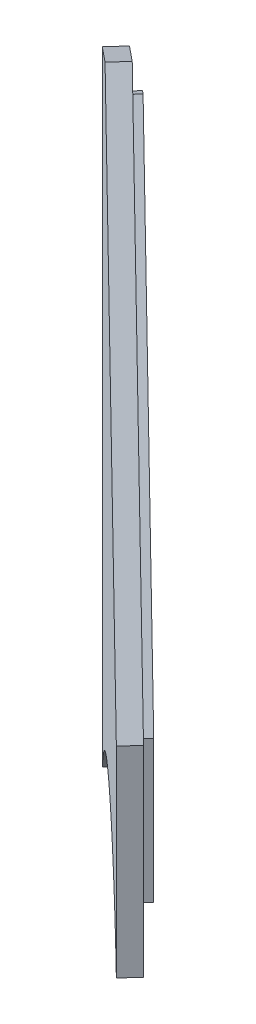
ISO-10303-21;
HEADER;
FILE_DESCRIPTION(('STEP AP214'),'2;1');
FILE_NAME('part.step','',(''),(''),'','','');
FILE_SCHEMA(('AUTOMOTIVE_DESIGN { 1 0 10303 214 1 1 1 1 }'));
ENDSEC;
DATA;
#1=APPLICATION_CONTEXT('core data for automotive mechanical design processes');
#2=APPLICATION_PROTOCOL_DEFINITION('international standard','automotive_design',2000,#1);
#3=PRODUCT_CONTEXT('',#1,'mechanical');
#4=PRODUCT('Part','Part','',(#3));
#5=PRODUCT_RELATED_PRODUCT_CATEGORY('part','',(#4));
#6=PRODUCT_DEFINITION_FORMATION('','',#4);
#7=PRODUCT_DEFINITION_CONTEXT('part definition',#1,'design');
#8=PRODUCT_DEFINITION('design','',#6,#7);
#9=PRODUCT_DEFINITION_SHAPE('','',#8);
#10=(LENGTH_UNIT() NAMED_UNIT(*) SI_UNIT(.MILLI.,.METRE.));
#11=(NAMED_UNIT(*) PLANE_ANGLE_UNIT() SI_UNIT($,.RADIAN.));
#12=(NAMED_UNIT(*) SI_UNIT($,.STERADIAN.) SOLID_ANGLE_UNIT());
#13=UNCERTAINTY_MEASURE_WITH_UNIT(LENGTH_MEASURE(1.E-05),#10,'distance_accuracy_value','');
#14=(GEOMETRIC_REPRESENTATION_CONTEXT(3) GLOBAL_UNCERTAINTY_ASSIGNED_CONTEXT((#13)) GLOBAL_UNIT_ASSIGNED_CONTEXT((#10,
#11,#12)) REPRESENTATION_CONTEXT('',''));
#15=CARTESIAN_POINT('',(0.,0.,0.));
#16=DIRECTION('',(0.,0.,1.));
#17=DIRECTION('',(1.,0.,0.));
#18=AXIS2_PLACEMENT_3D('',#15,#16,#17);
#19=CARTESIAN_POINT('',(-20.6931381467478,0.,22.4683085436568));
#20=DIRECTION('',(0.677451726752943,0.,-0.735567235485279));
#21=DIRECTION('',(-0.735567235485279,0.,-0.677451726752943));
#22=AXIS2_PLACEMENT_3D('',#19,#20,#21);
#23=PLANE('',#22);
#24=CARTESIAN_POINT('',(39.5791169193951,2.7952897892642E-13,77.9785886377863));
#25=DIRECTION('',(0.677451726752943,0.,-0.735567235485279));
#26=DIRECTION('',(-0.735567235485279,0.,-0.677451726752943));
#27=AXIS2_PLACEMENT_3D('',#24,#25,#26);
#28=CIRCLE('',#27,7.13247995583063);
#29=CARTESIAN_POINT('',(35.0627980325562,3.62956440215815,73.8190939228845));
#30=VERTEX_POINT('',#29);
#31=CARTESIAN_POINT('',(44.3267041328688,3.0354584442088,82.3510796902951));
#32=VERTEX_POINT('',#31);
#33=EDGE_CURVE('E134',#30,#32,#28,.T.);
#34=ORIENTED_EDGE('',*,*,#33,.F.);
#35=DIRECTION('',(0.,1.,0.));
#36=VECTOR('',#35,1.);
#37=CARTESIAN_POINT('',(35.0627980325562,2.86264043382394E-13,73.8190939228846));
#38=LINE('',#37,#36);
#39=CARTESIAN_POINT('',(35.0627980325562,36.079389418148,73.8190939228844));
#40=VERTEX_POINT('',#39);
#41=EDGE_CURVE('E103',#30,#40,#38,.T.);
#42=ORIENTED_EDGE('',*,*,#41,.T.);
#43=DIRECTION('',(0.676466625292488,0.392731884870092,0.623020522512524));
#44=VECTOR('',#43,1.);
#45=CARTESIAN_POINT('',(-21.6786473222887,3.13737284072044,21.5606622259675));
#46=LINE('',#45,#44);
#47=CARTESIAN_POINT('',(36.8938334846824,37.1424219130128,75.5054633925228));
#48=VERTEX_POINT('',#47);
#49=EDGE_CURVE('E97',#40,#48,#46,.T.);
#50=ORIENTED_EDGE('',*,*,#49,.T.);
#51=DIRECTION('',(0.288880706840819,-0.919653014243079,0.266056893556188));
#52=VECTOR('',#51,1.);
#53=CARTESIAN_POINT('',(37.8793426602231,34.005049072293,76.4131097102119));
#54=LINE('',#53,#52);
#55=CARTESIAN_POINT('',(44.3267041328689,13.4798451669292,82.3510796902951));
#56=VERTEX_POINT('',#55);
#57=EDGE_CURVE('E101',#48,#56,#54,.T.);
#58=ORIENTED_EDGE('',*,*,#57,.T.);
#59=DIRECTION('',(0.,-1.,0.));
#60=VECTOR('',#59,1.);
#61=CARTESIAN_POINT('',(44.3267041328688,2.47750014474514E-13,82.3510796902951));
#62=LINE('',#61,#60);
#63=EDGE_CURVE('E61',#56,#32,#62,.T.);
#64=ORIENTED_EDGE('',*,*,#63,.T.);
#65=EDGE_LOOP('',(#34,#42,#50,#58,#64));
#66=FACE_BOUND('',#65,.T.);
#67=DIRECTION('',(-0.646578037554501,0.476785584881775,-0.595493364699486));
#68=VECTOR('',#67,1.);
#69=CARTESIAN_POINT('',(-4.16892793137725,41.4165377906152,37.6869781683934));
#70=LINE('',#69,#68);
#71=CARTESIAN_POINT('',(43.8853637915776,5.98138185512251,81.9446086542433));
#72=VERTEX_POINT('',#71);
#73=CARTESIAN_POINT('',(43.4440234502865,6.30682549924984,81.5381376181915));
#74=VERTEX_POINT('',#73);
#75=EDGE_CURVE('E172',#72,#74,#70,.T.);
#76=ORIENTED_EDGE('',*,*,#75,.F.);
#77=DIRECTION('',(0.,-1.,0.));
#78=VECTOR('',#77,1.);
#79=CARTESIAN_POINT('',(43.8853637915776,3.06900848732018E-13,81.9446086542433));
#80=LINE('',#79,#78);
#81=CARTESIAN_POINT('',(43.8853637915777,13.3570942691505,81.9446086542433));
#82=VERTEX_POINT('',#81);
#83=EDGE_CURVE('E175',#82,#72,#80,.T.);
#84=ORIENTED_EDGE('',*,*,#83,.F.);
#85=DIRECTION('',(0.288880706840814,-0.919653014243081,0.266056893556184));
#86=VECTOR('',#85,1.);
#87=CARTESIAN_POINT('',(37.4734626850478,33.7694099413704,76.0392973967046));
#88=LINE('',#87,#86);
#89=CARTESIAN_POINT('',(36.8822261021151,35.6516142310617,75.4947730830801));
#90=VERTEX_POINT('',#89);
#91=EDGE_CURVE('E161',#90,#82,#88,.T.);
#92=ORIENTED_EDGE('',*,*,#91,.F.);
#93=DIRECTION('',(-0.676466625292492,-0.392731884870078,-0.623020522512528));
#94=VECTOR('',#93,1.);
#95=CARTESIAN_POINT('',(-21.2843747296808,1.88220428969252,21.923784230032));
#96=LINE('',#95,#94);
#97=CARTESIAN_POINT('',(36.4763461269396,35.4159751001397,75.1209607695726));
#98=VERTEX_POINT('',#97);
#99=EDGE_CURVE('E52',#90,#98,#96,.T.);
#100=ORIENTED_EDGE('',*,*,#99,.T.);
#101=DIRECTION('',(0.288880706840815,-0.919653014243081,0.266056893556184));
#102=VECTOR('',#101,1.);
#103=CARTESIAN_POINT('',(37.0675827098723,33.5337708104484,75.6654850831971));
#104=LINE('',#103,#102);
#105=CARTESIAN_POINT('',(43.4440234502865,13.2343433713717,81.5381376181916));
#106=VERTEX_POINT('',#105);
#107=EDGE_CURVE('E166',#98,#106,#104,.T.);
#108=ORIENTED_EDGE('',*,*,#107,.T.);
#109=DIRECTION('',(0.,-1.,0.));
#110=VECTOR('',#109,1.);
#111=CARTESIAN_POINT('',(43.4440234502865,3.19752646547121E-13,81.5381376181916));
#112=LINE('',#111,#110);
#113=EDGE_CURVE('E169',#106,#74,#112,.T.);
#114=ORIENTED_EDGE('',*,*,#113,.T.);
#115=EDGE_LOOP('',(#76,#84,#92,#100,#108,#114));
#116=FACE_BOUND('',#115,.T.);
#117=ADVANCED_FACE('F37',(#66,#116),#23,.T.);
#118=CARTESIAN_POINT('',(39.5791169193951,2.7952897892642E-13,77.9785886377863));
#119=DIRECTION('',(-0.677451726752943,0.,0.735567235485279));
#120=DIRECTION('',(0.735567235485279,0.,0.677451726752943));
#121=AXIS2_PLACEMENT_3D('',#118,#119,#120);
#122=CYLINDRICAL_SURFACE('',#121,7.13247995583063);
#123=CARTESIAN_POINT('',(38.9016651926422,2.82165758609905E-13,78.7141558732716));
#124=DIRECTION('',(0.677451726752943,0.,-0.735567235485279));
#125=DIRECTION('',(-0.735567235485279,0.,-0.677451726752943));
#126=AXIS2_PLACEMENT_3D('',#123,#124,#125);
#127=CIRCLE('',#126,7.13247995583063);
#128=CARTESIAN_POINT('',(34.3853463058033,3.62956440215815,74.5546611583698));
#129=VERTEX_POINT('',#128);
#130=CARTESIAN_POINT('',(43.6492524061159,3.03545844420881,83.0866469257803));
#131=VERTEX_POINT('',#130);
#132=EDGE_CURVE('E123',#129,#131,#127,.T.);
#133=ORIENTED_EDGE('',*,*,#132,.F.);
#134=DIRECTION('',(-0.677451726752943,0.,0.735567235485279));
#135=VECTOR('',#134,1.);
#136=CARTESIAN_POINT('',(35.0627980325562,3.62956440215815,73.8190939228845));
#137=LINE('',#136,#135);
#138=EDGE_CURVE('E11',#30,#129,#137,.T.);
#139=ORIENTED_EDGE('',*,*,#138,.F.);
#140=ORIENTED_EDGE('',*,*,#33,.T.);
#141=DIRECTION('',(-0.677451726752943,0.,0.735567235485279));
#142=VECTOR('',#141,1.);
#143=CARTESIAN_POINT('',(44.3267041328688,3.0354584442088,82.3510796902951));
#144=LINE('',#143,#142);
#145=EDGE_CURVE('E84',#32,#131,#144,.T.);
#146=ORIENTED_EDGE('',*,*,#145,.T.);
#147=EDGE_LOOP('',(#133,#139,#140,#146));
#148=FACE_BOUND('',#147,.T.);
#149=ADVANCED_FACE('F39',(#148),#122,.F.);
#150=CARTESIAN_POINT('',(35.0627980325562,2.86264043382394E-13,73.8190939228846));
#151=DIRECTION('',(0.735567235485279,0.,0.677451726752943));
#152=DIRECTION('',(0.677451726752943,0.,-0.735567235485279));
#153=AXIS2_PLACEMENT_3D('',#150,#151,#152);
#154=PLANE('',#153);
#155=DIRECTION('',(0.,1.,0.));
#156=VECTOR('',#155,1.);
#157=CARTESIAN_POINT('',(34.3853463058033,2.88900823065878E-13,74.5546611583698));
#158=LINE('',#157,#156);
#159=CARTESIAN_POINT('',(34.3853463058033,36.079389418148,74.5546611583697));
#160=VERTEX_POINT('',#159);
#161=EDGE_CURVE('E126',#129,#160,#158,.T.);
#162=ORIENTED_EDGE('',*,*,#161,.T.);
#163=DIRECTION('',(-0.677451726752943,0.,0.735567235485279));
#164=VECTOR('',#163,1.);
#165=CARTESIAN_POINT('',(35.0627980325562,36.079389418148,73.8190939228844));
#166=LINE('',#165,#164);
#167=EDGE_CURVE('E45',#40,#160,#166,.T.);
#168=ORIENTED_EDGE('',*,*,#167,.F.);
#169=ORIENTED_EDGE('',*,*,#41,.F.);
#170=ORIENTED_EDGE('',*,*,#138,.T.);
#171=EDGE_LOOP('',(#162,#168,#169,#170));
#172=FACE_BOUND('',#171,.T.);
#173=ADVANCED_FACE('F253',(#172),#154,.F.);
#174=CARTESIAN_POINT('',(-21.6786473222887,3.13737284072044,21.5606622259675));
#175=DIRECTION('',(0.288880706840815,-0.919653014243081,0.266056893556184));
#176=DIRECTION('',(0.954039134236166,0.299682048754853,0.));
#177=AXIS2_PLACEMENT_3D('',#174,#175,#176);
#178=PLANE('',#177);
#179=DIRECTION('',(0.676466625292488,0.392731884870092,0.623020522512524));
#180=VECTOR('',#179,1.);
#181=CARTESIAN_POINT('',(-22.3560990490417,3.13737284072044,22.2962294614528));
#182=LINE('',#181,#180);
#183=CARTESIAN_POINT('',(36.2163817579294,37.1424219130128,76.2410306280081));
#184=VERTEX_POINT('',#183);
#185=EDGE_CURVE('E112',#160,#184,#182,.T.);
#186=ORIENTED_EDGE('',*,*,#185,.T.);
#187=DIRECTION('',(-0.677451726752943,0.,0.735567235485279));
#188=VECTOR('',#187,1.);
#189=CARTESIAN_POINT('',(36.8938334846824,37.1424219130128,75.5054633925228));
#190=LINE('',#189,#188);
#191=EDGE_CURVE('E109',#48,#184,#190,.T.);
#192=ORIENTED_EDGE('',*,*,#191,.F.);
#193=ORIENTED_EDGE('',*,*,#49,.F.);
#194=ORIENTED_EDGE('',*,*,#167,.T.);
#195=EDGE_LOOP('',(#186,#192,#193,#194));
#196=FACE_BOUND('',#195,.T.);
#197=ADVANCED_FACE('F110',(#196),#178,.F.);
#198=CARTESIAN_POINT('',(37.8793426602231,34.005049072293,76.4131097102119));
#199=DIRECTION('',(-0.676466625292485,-0.392731884870099,-0.623020522512522));
#200=DIRECTION('',(-0.677451726752943,0.,0.735567235485279));
#201=AXIS2_PLACEMENT_3D('',#198,#199,#200);
#202=PLANE('',#201);
#203=DIRECTION('',(0.288880706840819,-0.919653014243079,0.266056893556188));
#204=VECTOR('',#203,1.);
#205=CARTESIAN_POINT('',(37.2018909334701,34.005049072293,77.1486769456972));
#206=LINE('',#205,#204);
#207=CARTESIAN_POINT('',(43.6492524061159,13.4798451669292,83.0866469257804));
#208=VERTEX_POINT('',#207);
#209=EDGE_CURVE('E130',#184,#208,#206,.T.);
#210=ORIENTED_EDGE('',*,*,#209,.T.);
#211=DIRECTION('',(-0.677451726752943,0.,0.735567235485279));
#212=VECTOR('',#211,1.);
#213=CARTESIAN_POINT('',(44.3267041328689,13.4798451669292,82.3510796902951));
#214=LINE('',#213,#212);
#215=EDGE_CURVE('E115',#56,#208,#214,.T.);
#216=ORIENTED_EDGE('',*,*,#215,.F.);
#217=ORIENTED_EDGE('',*,*,#57,.F.);
#218=ORIENTED_EDGE('',*,*,#191,.T.);
#219=EDGE_LOOP('',(#210,#216,#217,#218));
#220=FACE_BOUND('',#219,.T.);
#221=ADVANCED_FACE('F117',(#220),#202,.F.);
#222=CARTESIAN_POINT('',(44.3267041328688,2.47750014474514E-13,82.3510796902951));
#223=DIRECTION('',(-0.735567235485279,0.,-0.677451726752943));
#224=DIRECTION('',(-0.677451726752943,0.,0.735567235485279));
#225=AXIS2_PLACEMENT_3D('',#222,#223,#224);
#226=PLANE('',#225);
#227=DIRECTION('',(0.,-1.,0.));
#228=VECTOR('',#227,1.);
#229=CARTESIAN_POINT('',(43.6492524061159,2.50386794157999E-13,83.0866469257804));
#230=LINE('',#229,#228);
#231=EDGE_CURVE('E132',#208,#131,#230,.T.);
#232=ORIENTED_EDGE('',*,*,#231,.T.);
#233=ORIENTED_EDGE('',*,*,#145,.F.);
#234=ORIENTED_EDGE('',*,*,#63,.F.);
#235=ORIENTED_EDGE('',*,*,#215,.T.);
#236=EDGE_LOOP('',(#232,#233,#234,#235));
#237=FACE_BOUND('',#236,.T.);
#238=ADVANCED_FACE('F142',(#237),#226,.F.);
#239=CARTESIAN_POINT('',(-21.3705898735007,0.,23.2038757791421));
#240=DIRECTION('',(0.677451726752943,0.,-0.735567235485279));
#241=DIRECTION('',(-0.735567235485279,0.,-0.677451726752943));
#242=AXIS2_PLACEMENT_3D('',#239,#240,#241);
#243=PLANE('',#242);
#244=ORIENTED_EDGE('',*,*,#132,.T.);
#245=ORIENTED_EDGE('',*,*,#231,.F.);
#246=ORIENTED_EDGE('',*,*,#209,.F.);
#247=ORIENTED_EDGE('',*,*,#185,.F.);
#248=ORIENTED_EDGE('',*,*,#161,.F.);
#249=EDGE_LOOP('',(#244,#245,#246,#247,#248));
#250=FACE_BOUND('',#249,.T.);
#251=ADVANCED_FACE('F139',(#250),#243,.F.);
#252=CARTESIAN_POINT('',(44.1563444822788,3.057684212469E-13,81.6503817600492));
#253=DIRECTION('',(-0.735567235485279,0.,-0.677451726752944));
#254=DIRECTION('',(-0.677451726752944,0.,0.735567235485279));
#255=AXIS2_PLACEMENT_3D('',#252,#253,#254);
#256=PLANE('',#255);
#257=ORIENTED_EDGE('',*,*,#83,.T.);
#258=DIRECTION('',(-0.677451726752944,0.,0.735567235485279));
#259=VECTOR('',#258,1.);
#260=CARTESIAN_POINT('',(44.1563444822788,5.98138185512251,81.6503817600492));
#261=LINE('',#260,#259);
#262=CARTESIAN_POINT('',(44.1563444822788,5.98138185512251,81.6503817600492));
#263=VERTEX_POINT('',#262);
#264=EDGE_CURVE('E127',#263,#72,#261,.T.);
#265=ORIENTED_EDGE('',*,*,#264,.F.);
#266=DIRECTION('',(0.,-1.,0.));
#267=VECTOR('',#266,1.);
#268=CARTESIAN_POINT('',(44.1563444822788,3.057684212469E-13,81.6503817600492));
#269=LINE('',#268,#267);
#270=CARTESIAN_POINT('',(44.1563444822789,13.3570942691505,81.6503817600492));
#271=VERTEX_POINT('',#270);
#272=EDGE_CURVE('E164',#271,#263,#269,.T.);
#273=ORIENTED_EDGE('',*,*,#272,.F.);
#274=DIRECTION('',(-0.677451726752944,0.,0.735567235485279));
#275=VECTOR('',#274,1.);
#276=CARTESIAN_POINT('',(44.1563444822789,13.3570942691505,81.6503817600492));
#277=LINE('',#276,#275);
#278=EDGE_CURVE('E157',#271,#82,#277,.T.);
#279=ORIENTED_EDGE('',*,*,#278,.T.);
#280=EDGE_LOOP('',(#257,#265,#273,#279));
#281=FACE_BOUND('',#280,.T.);
#282=ADVANCED_FACE('F207',(#281),#256,.F.);
#283=CARTESIAN_POINT('',(-3.89794724067607,41.4165377906152,37.3927512741993));
#284=DIRECTION('',(0.350707854590721,0.879019627795047,0.322999217769069));
#285=DIRECTION('',(-0.928804249378842,0.370570730543855,0.));
#286=AXIS2_PLACEMENT_3D('',#283,#284,#285);
#287=PLANE('',#286);
#288=ORIENTED_EDGE('',*,*,#75,.T.);
#289=DIRECTION('',(-0.677451726752944,0.,0.735567235485279));
#290=VECTOR('',#289,1.);
#291=CARTESIAN_POINT('',(43.7150041409877,6.30682549924984,81.2439107239974));
#292=LINE('',#291,#290);
#293=CARTESIAN_POINT('',(43.7150041409877,6.30682549924984,81.2439107239974));
#294=VERTEX_POINT('',#293);
#295=EDGE_CURVE('E147',#294,#74,#292,.T.);
#296=ORIENTED_EDGE('',*,*,#295,.F.);
#297=DIRECTION('',(-0.646578037554501,0.476785584881775,-0.595493364699486));
#298=VECTOR('',#297,1.);
#299=CARTESIAN_POINT('',(-3.89794724067607,41.4165377906152,37.3927512741993));
#300=LINE('',#299,#298);
#301=EDGE_CURVE('E189',#263,#294,#300,.T.);
#302=ORIENTED_EDGE('',*,*,#301,.F.);
#303=ORIENTED_EDGE('',*,*,#264,.T.);
#304=EDGE_LOOP('',(#288,#296,#302,#303));
#305=FACE_BOUND('',#304,.T.);
#306=ADVANCED_FACE('F212',(#305),#287,.F.);
#307=CARTESIAN_POINT('',(43.7150041409877,3.18620219062004E-13,81.2439107239974));
#308=DIRECTION('',(-0.735567235485279,0.,-0.677451726752944));
#309=DIRECTION('',(-0.677451726752944,0.,0.735567235485279));
#310=AXIS2_PLACEMENT_3D('',#307,#308,#309);
#311=PLANE('',#310);
#312=ORIENTED_EDGE('',*,*,#113,.F.);
#313=DIRECTION('',(-0.677451726752944,0.,0.735567235485279));
#314=VECTOR('',#313,1.);
#315=CARTESIAN_POINT('',(43.7150041409877,13.2343433713717,81.2439107239974));
#316=LINE('',#315,#314);
#317=CARTESIAN_POINT('',(43.7150041409877,13.2343433713717,81.2439107239974));
#318=VERTEX_POINT('',#317);
#319=EDGE_CURVE('E150',#318,#106,#316,.T.);
#320=ORIENTED_EDGE('',*,*,#319,.F.);
#321=DIRECTION('',(0.,-1.,0.));
#322=VECTOR('',#321,1.);
#323=CARTESIAN_POINT('',(43.7150041409877,3.18620219062004E-13,81.2439107239974));
#324=LINE('',#323,#322);
#325=EDGE_CURVE('E186',#318,#294,#324,.T.);
#326=ORIENTED_EDGE('',*,*,#325,.T.);
#327=ORIENTED_EDGE('',*,*,#295,.T.);
#328=EDGE_LOOP('',(#312,#320,#326,#327));
#329=FACE_BOUND('',#328,.T.);
#330=ADVANCED_FACE('F229',(#329),#311,.T.);
#331=CARTESIAN_POINT('',(37.3385634005735,33.5337708104484,75.371258189003));
#332=DIRECTION('',(-0.676466625292487,-0.392731884870093,-0.623020522512524));
#333=DIRECTION('',(-0.677451726752943,0.,0.735567235485279));
#334=AXIS2_PLACEMENT_3D('',#331,#332,#333);
#335=PLANE('',#334);
#336=ORIENTED_EDGE('',*,*,#107,.F.);
#337=DIRECTION('',(-0.677451726752944,0.,0.735567235485279));
#338=VECTOR('',#337,1.);
#339=CARTESIAN_POINT('',(36.7473268176408,35.4159751001397,74.8267338753785));
#340=LINE('',#339,#338);
#341=CARTESIAN_POINT('',(36.7473268176408,35.4159751001397,74.8267338753785));
#342=VERTEX_POINT('',#341);
#343=EDGE_CURVE('E153',#342,#98,#340,.T.);
#344=ORIENTED_EDGE('',*,*,#343,.F.);
#345=DIRECTION('',(0.288880706840815,-0.919653014243081,0.266056893556184));
#346=VECTOR('',#345,1.);
#347=CARTESIAN_POINT('',(37.3385634005735,33.5337708104484,75.371258189003));
#348=LINE('',#347,#346);
#349=EDGE_CURVE('E183',#342,#318,#348,.T.);
#350=ORIENTED_EDGE('',*,*,#349,.T.);
#351=ORIENTED_EDGE('',*,*,#319,.T.);
#352=EDGE_LOOP('',(#336,#344,#350,#351));
#353=FACE_BOUND('',#352,.T.);
#354=ADVANCED_FACE('F239',(#353),#335,.T.);
#355=CARTESIAN_POINT('',(-21.0133940389796,1.88220428969252,21.6295573358379));
#356=DIRECTION('',(-0.288880706840804,0.919653014243087,-0.266056893556175));
#357=DIRECTION('',(-0.95403913423617,-0.299682048754841,0.));
#358=AXIS2_PLACEMENT_3D('',#355,#356,#357);
#359=PLANE('',#358);
#360=ORIENTED_EDGE('',*,*,#99,.F.);
#361=DIRECTION('',(-0.677451726752944,0.,0.735567235485279));
#362=VECTOR('',#361,1.);
#363=CARTESIAN_POINT('',(37.1532067928163,35.6516142310617,75.200546188886));
#364=LINE('',#363,#362);
#365=CARTESIAN_POINT('',(37.1532067928163,35.6516142310617,75.200546188886));
#366=VERTEX_POINT('',#365);
#367=EDGE_CURVE('E155',#366,#90,#364,.T.);
#368=ORIENTED_EDGE('',*,*,#367,.F.);
#369=DIRECTION('',(-0.676466625292492,-0.392731884870078,-0.623020522512528));
#370=VECTOR('',#369,1.);
#371=CARTESIAN_POINT('',(-21.0133940389796,1.88220428969252,21.6295573358379));
#372=LINE('',#371,#370);
#373=EDGE_CURVE('E180',#366,#342,#372,.T.);
#374=ORIENTED_EDGE('',*,*,#373,.T.);
#375=ORIENTED_EDGE('',*,*,#343,.T.);
#376=EDGE_LOOP('',(#360,#368,#374,#375));
#377=FACE_BOUND('',#376,.T.);
#378=ADVANCED_FACE('F236',(#377),#359,.T.);
#379=CARTESIAN_POINT('',(37.744443375749,33.7694099413704,75.7450705025105));
#380=DIRECTION('',(-0.676466625292487,-0.392731884870092,-0.623020522512524));
#381=DIRECTION('',(-0.677451726752943,0.,0.735567235485279));
#382=AXIS2_PLACEMENT_3D('',#379,#380,#381);
#383=PLANE('',#382);
#384=ORIENTED_EDGE('',*,*,#91,.T.);
#385=ORIENTED_EDGE('',*,*,#278,.F.);
#386=DIRECTION('',(0.288880706840814,-0.919653014243081,0.266056893556184));
#387=VECTOR('',#386,1.);
#388=CARTESIAN_POINT('',(37.744443375749,33.7694099413704,75.7450705025105));
#389=LINE('',#388,#387);
#390=EDGE_CURVE('E160',#366,#271,#389,.T.);
#391=ORIENTED_EDGE('',*,*,#390,.F.);
#392=ORIENTED_EDGE('',*,*,#367,.T.);
#393=EDGE_LOOP('',(#384,#385,#391,#392));
#394=FACE_BOUND('',#393,.T.);
#395=ADVANCED_FACE('F225',(#394),#383,.F.);
#396=CARTESIAN_POINT('',(-20.4221574560466,0.,22.1740816494627));
#397=DIRECTION('',(0.677451726752944,0.,-0.735567235485279));
#398=DIRECTION('',(-0.735567235485279,0.,-0.677451726752944));
#399=AXIS2_PLACEMENT_3D('',#396,#397,#398);
#400=PLANE('',#399);
#401=ORIENTED_EDGE('',*,*,#272,.T.);
#402=ORIENTED_EDGE('',*,*,#301,.T.);
#403=ORIENTED_EDGE('',*,*,#325,.F.);
#404=ORIENTED_EDGE('',*,*,#349,.F.);
#405=ORIENTED_EDGE('',*,*,#373,.F.);
#406=ORIENTED_EDGE('',*,*,#390,.T.);
#407=EDGE_LOOP('',(#401,#402,#403,#404,#405,#406));
#408=FACE_BOUND('',#407,.T.);
#409=ADVANCED_FACE('F197',(#408),#400,.T.);
#410=CLOSED_SHELL('',(#117,#149,#173,#197,#221,#238,#251,#282,#306,#330,#354,#378,#395,#409));
#411=MANIFOLD_SOLID_BREP('B2',#410);
#412=ADVANCED_BREP_SHAPE_REPRESENTATION('',(#18,#411),#14);
#413=SHAPE_DEFINITION_REPRESENTATION(#9,#412);
ENDSEC;
END-ISO-10303-21;
